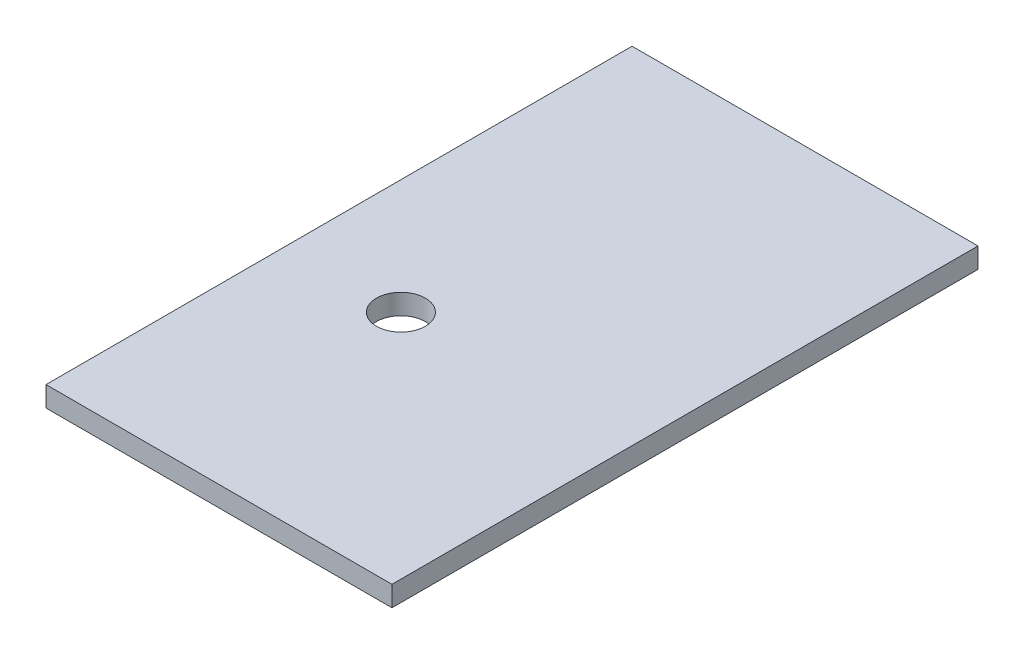
ISO-10303-21;
HEADER;
FILE_DESCRIPTION(('STEP AP214'),'2;1');
FILE_NAME('part.step','',(''),(''),'','','');
FILE_SCHEMA(('AUTOMOTIVE_DESIGN { 1 0 10303 214 1 1 1 1 }'));
ENDSEC;
DATA;
#1=APPLICATION_CONTEXT('core data for automotive mechanical design processes');
#2=APPLICATION_PROTOCOL_DEFINITION('international standard','automotive_design',2000,#1);
#3=PRODUCT_CONTEXT('',#1,'mechanical');
#4=PRODUCT('Part','Part','',(#3));
#5=PRODUCT_RELATED_PRODUCT_CATEGORY('part','',(#4));
#6=PRODUCT_DEFINITION_FORMATION('','',#4);
#7=PRODUCT_DEFINITION_CONTEXT('part definition',#1,'design');
#8=PRODUCT_DEFINITION('design','',#6,#7);
#9=PRODUCT_DEFINITION_SHAPE('','',#8);
#10=(LENGTH_UNIT() NAMED_UNIT(*) SI_UNIT(.MILLI.,.METRE.));
#11=(NAMED_UNIT(*) PLANE_ANGLE_UNIT() SI_UNIT($,.RADIAN.));
#12=(NAMED_UNIT(*) SI_UNIT($,.STERADIAN.) SOLID_ANGLE_UNIT());
#13=UNCERTAINTY_MEASURE_WITH_UNIT(LENGTH_MEASURE(1.E-05),#10,'distance_accuracy_value','');
#14=(GEOMETRIC_REPRESENTATION_CONTEXT(3) GLOBAL_UNCERTAINTY_ASSIGNED_CONTEXT((#13)) GLOBAL_UNIT_ASSIGNED_CONTEXT((#10,
#11,#12)) REPRESENTATION_CONTEXT('',''));
#15=CARTESIAN_POINT('',(0.,0.,0.));
#16=DIRECTION('',(0.,0.,1.));
#17=DIRECTION('',(1.,0.,0.));
#18=AXIS2_PLACEMENT_3D('',#15,#16,#17);
#19=CARTESIAN_POINT('',(0.,2.5,0.));
#20=DIRECTION('',(0.,1.,0.));
#21=DIRECTION('',(0.,0.,1.));
#22=AXIS2_PLACEMENT_3D('',#19,#20,#21);
#23=PLANE('',#22);
#24=DIRECTION('',(0.,0.,1.));
#25=VECTOR('',#24,1.);
#26=CARTESIAN_POINT('',(-21.25,2.5,-36.));
#27=LINE('',#26,#25);
#28=CARTESIAN_POINT('',(-21.25,2.5,-36.));
#29=VERTEX_POINT('',#28);
#30=CARTESIAN_POINT('',(-21.25,2.5,36.));
#31=VERTEX_POINT('',#30);
#32=EDGE_CURVE('E87',#29,#31,#27,.T.);
#33=ORIENTED_EDGE('',*,*,#32,.T.);
#34=DIRECTION('',(1.,0.,0.));
#35=VECTOR('',#34,1.);
#36=CARTESIAN_POINT('',(-21.25,2.5,36.));
#37=LINE('',#36,#35);
#38=CARTESIAN_POINT('',(21.25,2.5,36.));
#39=VERTEX_POINT('',#38);
#40=EDGE_CURVE('E82',#31,#39,#37,.T.);
#41=ORIENTED_EDGE('',*,*,#40,.T.);
#42=DIRECTION('',(0.,0.,-1.));
#43=VECTOR('',#42,1.);
#44=CARTESIAN_POINT('',(21.25,2.5,-36.));
#45=LINE('',#44,#43);
#46=CARTESIAN_POINT('',(21.25,2.5,-36.));
#47=VERTEX_POINT('',#46);
#48=EDGE_CURVE('E85',#39,#47,#45,.T.);
#49=ORIENTED_EDGE('',*,*,#48,.T.);
#50=DIRECTION('',(-1.,0.,0.));
#51=VECTOR('',#50,1.);
#52=CARTESIAN_POINT('',(-21.25,2.5,-36.));
#53=LINE('',#52,#51);
#54=EDGE_CURVE('E52',#47,#29,#53,.T.);
#55=ORIENTED_EDGE('',*,*,#54,.T.);
#56=EDGE_LOOP('',(#33,#41,#49,#55));
#57=FACE_BOUND('',#56,.T.);
#58=CARTESIAN_POINT('',(-7.14956833360486,2.5,6.5));
#59=DIRECTION('',(0.,1.,0.));
#60=DIRECTION('',(0.,0.,1.));
#61=AXIS2_PLACEMENT_3D('',#58,#59,#60);
#62=CIRCLE('',#61,3.);
#63=CARTESIAN_POINT('',(-7.14956833360486,2.5,9.5));
#64=VERTEX_POINT('',#63);
#65=EDGE_CURVE('E102',#64,#64,#62,.T.);
#66=ORIENTED_EDGE('',*,*,#65,.F.);
#67=EDGE_LOOP('',(#66));
#68=FACE_BOUND('',#67,.T.);
#69=ADVANCED_FACE('F35',(#57,#68),#23,.T.);
#70=CARTESIAN_POINT('',(0.,0.,0.));
#71=DIRECTION('',(0.,1.,0.));
#72=DIRECTION('',(0.,0.,1.));
#73=AXIS2_PLACEMENT_3D('',#70,#71,#72);
#74=PLANE('',#73);
#75=DIRECTION('',(0.,0.,1.));
#76=VECTOR('',#75,1.);
#77=CARTESIAN_POINT('',(-21.25,0.,-36.));
#78=LINE('',#77,#76);
#79=CARTESIAN_POINT('',(-21.25,0.,-36.));
#80=VERTEX_POINT('',#79);
#81=CARTESIAN_POINT('',(-21.25,0.,36.));
#82=VERTEX_POINT('',#81);
#83=EDGE_CURVE('E99',#80,#82,#78,.T.);
#84=ORIENTED_EDGE('',*,*,#83,.F.);
#85=DIRECTION('',(-1.,0.,0.));
#86=VECTOR('',#85,1.);
#87=CARTESIAN_POINT('',(-21.25,0.,-36.));
#88=LINE('',#87,#86);
#89=CARTESIAN_POINT('',(21.25,0.,-36.));
#90=VERTEX_POINT('',#89);
#91=EDGE_CURVE('E75',#90,#80,#88,.T.);
#92=ORIENTED_EDGE('',*,*,#91,.F.);
#93=DIRECTION('',(0.,0.,-1.));
#94=VECTOR('',#93,1.);
#95=CARTESIAN_POINT('',(21.25,0.,-36.));
#96=LINE('',#95,#94);
#97=CARTESIAN_POINT('',(21.25,0.,36.));
#98=VERTEX_POINT('',#97);
#99=EDGE_CURVE('E69',#98,#90,#96,.T.);
#100=ORIENTED_EDGE('',*,*,#99,.F.);
#101=DIRECTION('',(1.,0.,0.));
#102=VECTOR('',#101,1.);
#103=CARTESIAN_POINT('',(-21.25,0.,36.));
#104=LINE('',#103,#102);
#105=EDGE_CURVE('E91',#82,#98,#104,.T.);
#106=ORIENTED_EDGE('',*,*,#105,.F.);
#107=EDGE_LOOP('',(#84,#92,#100,#106));
#108=FACE_BOUND('',#107,.T.);
#109=CARTESIAN_POINT('',(-7.14956833360486,0.,6.5));
#110=DIRECTION('',(0.,1.,0.));
#111=DIRECTION('',(0.,0.,1.));
#112=AXIS2_PLACEMENT_3D('',#109,#110,#111);
#113=CIRCLE('',#112,3.);
#114=CARTESIAN_POINT('',(-7.14956833360486,0.,9.5));
#115=VERTEX_POINT('',#114);
#116=EDGE_CURVE('E114',#115,#115,#113,.T.);
#117=ORIENTED_EDGE('',*,*,#116,.T.);
#118=EDGE_LOOP('',(#117));
#119=FACE_BOUND('',#118,.T.);
#120=ADVANCED_FACE('F110',(#108,#119),#74,.F.);
#121=CARTESIAN_POINT('',(-21.25,2.5,-36.));
#122=DIRECTION('',(1.,0.,0.));
#123=DIRECTION('',(0.,0.,-1.));
#124=AXIS2_PLACEMENT_3D('',#121,#122,#123);
#125=PLANE('',#124);
#126=ORIENTED_EDGE('',*,*,#83,.T.);
#127=DIRECTION('',(0.,-1.,0.));
#128=VECTOR('',#127,1.);
#129=CARTESIAN_POINT('',(-21.25,2.5,36.));
#130=LINE('',#129,#128);
#131=EDGE_CURVE('E11',#31,#82,#130,.T.);
#132=ORIENTED_EDGE('',*,*,#131,.F.);
#133=ORIENTED_EDGE('',*,*,#32,.F.);
#134=DIRECTION('',(0.,-1.,0.));
#135=VECTOR('',#134,1.);
#136=CARTESIAN_POINT('',(-21.25,2.5,-36.));
#137=LINE('',#136,#135);
#138=EDGE_CURVE('E95',#29,#80,#137,.T.);
#139=ORIENTED_EDGE('',*,*,#138,.T.);
#140=EDGE_LOOP('',(#126,#132,#133,#139));
#141=FACE_BOUND('',#140,.T.);
#142=ADVANCED_FACE('F37',(#141),#125,.F.);
#143=CARTESIAN_POINT('',(-21.25,2.5,36.));
#144=DIRECTION('',(0.,0.,-1.));
#145=DIRECTION('',(-1.,0.,0.));
#146=AXIS2_PLACEMENT_3D('',#143,#144,#145);
#147=PLANE('',#146);
#148=ORIENTED_EDGE('',*,*,#105,.T.);
#149=DIRECTION('',(0.,-1.,0.));
#150=VECTOR('',#149,1.);
#151=CARTESIAN_POINT('',(21.25,2.5,36.));
#152=LINE('',#151,#150);
#153=EDGE_CURVE('E44',#39,#98,#152,.T.);
#154=ORIENTED_EDGE('',*,*,#153,.F.);
#155=ORIENTED_EDGE('',*,*,#40,.F.);
#156=ORIENTED_EDGE('',*,*,#131,.T.);
#157=EDGE_LOOP('',(#148,#154,#155,#156));
#158=FACE_BOUND('',#157,.T.);
#159=ADVANCED_FACE('F90',(#158),#147,.F.);
#160=CARTESIAN_POINT('',(21.25,2.5,-36.));
#161=DIRECTION('',(-1.,0.,0.));
#162=DIRECTION('',(0.,0.,1.));
#163=AXIS2_PLACEMENT_3D('',#160,#161,#162);
#164=PLANE('',#163);
#165=ORIENTED_EDGE('',*,*,#99,.T.);
#166=DIRECTION('',(0.,-1.,0.));
#167=VECTOR('',#166,1.);
#168=CARTESIAN_POINT('',(21.25,2.5,-36.));
#169=LINE('',#168,#167);
#170=EDGE_CURVE('E92',#47,#90,#169,.T.);
#171=ORIENTED_EDGE('',*,*,#170,.F.);
#172=ORIENTED_EDGE('',*,*,#48,.F.);
#173=ORIENTED_EDGE('',*,*,#153,.T.);
#174=EDGE_LOOP('',(#165,#171,#172,#173));
#175=FACE_BOUND('',#174,.T.);
#176=ADVANCED_FACE('F93',(#175),#164,.F.);
#177=CARTESIAN_POINT('',(-21.25,2.5,-36.));
#178=DIRECTION('',(0.,0.,1.));
#179=DIRECTION('',(1.,0.,0.));
#180=AXIS2_PLACEMENT_3D('',#177,#178,#179);
#181=PLANE('',#180);
#182=ORIENTED_EDGE('',*,*,#91,.T.);
#183=ORIENTED_EDGE('',*,*,#138,.F.);
#184=ORIENTED_EDGE('',*,*,#54,.F.);
#185=ORIENTED_EDGE('',*,*,#170,.T.);
#186=EDGE_LOOP('',(#182,#183,#184,#185));
#187=FACE_BOUND('',#186,.T.);
#188=ADVANCED_FACE('F107',(#187),#181,.F.);
#189=CARTESIAN_POINT('',(-7.14956833360486,2.5,6.5));
#190=DIRECTION('',(0.,-1.,0.));
#191=DIRECTION('',(0.,0.,-1.));
#192=AXIS2_PLACEMENT_3D('',#189,#190,#191);
#193=CYLINDRICAL_SURFACE('',#192,3.);
#194=ORIENTED_EDGE('',*,*,#65,.T.);
#195=EDGE_LOOP('',(#194));
#196=FACE_BOUND('',#195,.T.);
#197=ORIENTED_EDGE('',*,*,#116,.F.);
#198=EDGE_LOOP('',(#197));
#199=FACE_BOUND('',#198,.T.);
#200=ADVANCED_FACE('F120',(#196,#199),#193,.F.);
#201=CLOSED_SHELL('',(#69,#120,#142,#159,#176,#188,#200));
#202=MANIFOLD_SOLID_BREP('B2',#201);
#203=ADVANCED_BREP_SHAPE_REPRESENTATION('',(#18,#202),#14);
#204=SHAPE_DEFINITION_REPRESENTATION(#9,#203);
ENDSEC;
END-ISO-10303-21;
